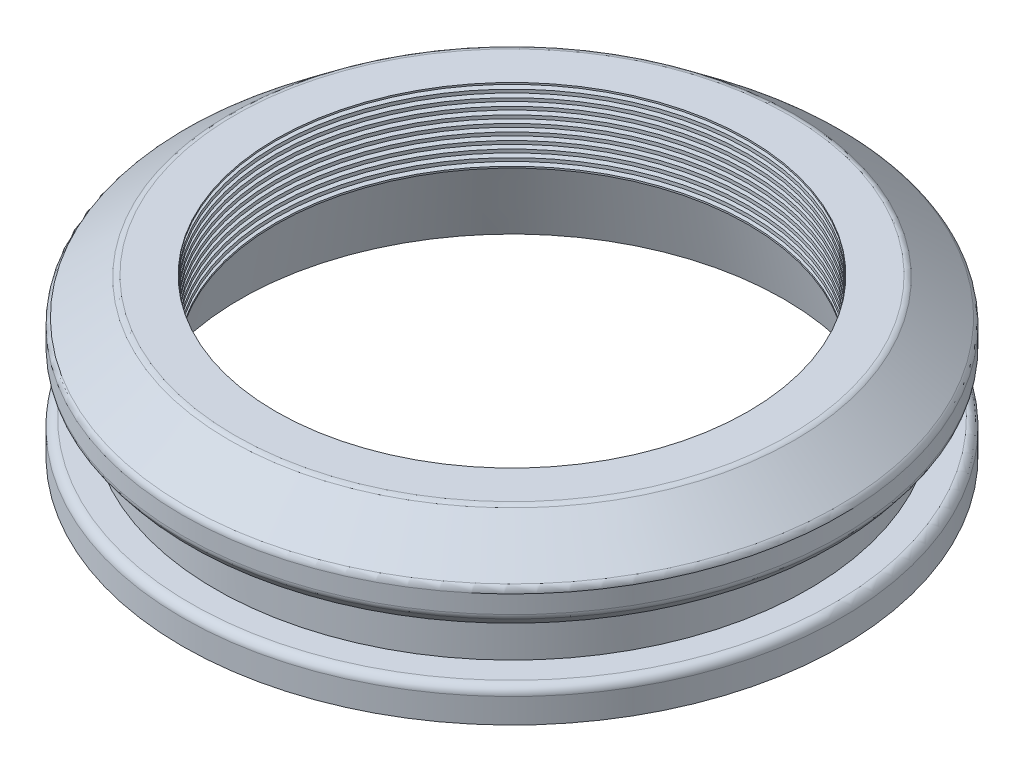
ISO-10303-21;
HEADER;
FILE_DESCRIPTION(('STEP AP214'),'2;1');
FILE_NAME('part.step','',(''),(''),'','','');
FILE_SCHEMA(('AUTOMOTIVE_DESIGN { 1 0 10303 214 1 1 1 1 }'));
ENDSEC;
DATA;
#1=APPLICATION_CONTEXT('core data for automotive mechanical design processes');
#2=APPLICATION_PROTOCOL_DEFINITION('international standard','automotive_design',2000,#1);
#3=PRODUCT_CONTEXT('',#1,'mechanical');
#4=PRODUCT('Part','Part','',(#3));
#5=PRODUCT_RELATED_PRODUCT_CATEGORY('part','',(#4));
#6=PRODUCT_DEFINITION_FORMATION('','',#4);
#7=PRODUCT_DEFINITION_CONTEXT('part definition',#1,'design');
#8=PRODUCT_DEFINITION('design','',#6,#7);
#9=PRODUCT_DEFINITION_SHAPE('','',#8);
#10=(LENGTH_UNIT() NAMED_UNIT(*) SI_UNIT(.MILLI.,.METRE.));
#11=(NAMED_UNIT(*) PLANE_ANGLE_UNIT() SI_UNIT($,.RADIAN.));
#12=(NAMED_UNIT(*) SI_UNIT($,.STERADIAN.) SOLID_ANGLE_UNIT());
#13=UNCERTAINTY_MEASURE_WITH_UNIT(LENGTH_MEASURE(1.E-05),#10,'distance_accuracy_value','');
#14=(GEOMETRIC_REPRESENTATION_CONTEXT(3) GLOBAL_UNCERTAINTY_ASSIGNED_CONTEXT((#13)) GLOBAL_UNIT_ASSIGNED_CONTEXT((#10,
#11,#12)) REPRESENTATION_CONTEXT('',''));
#15=CARTESIAN_POINT('',(0.,0.,0.));
#16=DIRECTION('',(0.,0.,1.));
#17=DIRECTION('',(1.,0.,0.));
#18=AXIS2_PLACEMENT_3D('',#15,#16,#17);
#19=CARTESIAN_POINT('',(101.6,47.117,0.));
#20=DIRECTION('',(0.,-1.,0.));
#21=DIRECTION('',(0.,0.,-1.));
#22=AXIS2_PLACEMENT_3D('',#19,#20,#21);
#23=TOROIDAL_SURFACE('',#22,77.1449944875122,0.254000000000001);
#24=CARTESIAN_POINT('',(101.6,46.8639665466847,0.));
#25=DIRECTION('',(0.,-1.,0.));
#26=DIRECTION('',(0.,0.,-1.));
#27=AXIS2_PLACEMENT_3D('',#24,#25,#26);
#28=CIRCLE('',#27,77.1671320461701);
#29=CARTESIAN_POINT('',(101.6,46.8639665466847,-77.1671320461701));
#30=VERTEX_POINT('',#29);
#31=EDGE_CURVE('E275',#30,#30,#28,.T.);
#32=ORIENTED_EDGE('',*,*,#31,.T.);
#33=EDGE_LOOP('',(#32));
#34=FACE_BOUND('',#33,.T.);
#35=CARTESIAN_POINT('',(101.6,47.3700334533153,0.));
#36=DIRECTION('',(0.,-1.,0.));
#37=DIRECTION('',(0.,0.,-1.));
#38=AXIS2_PLACEMENT_3D('',#35,#36,#37);
#39=CIRCLE('',#38,77.1671320461701);
#40=CARTESIAN_POINT('',(101.6,47.3700334533153,-77.1671320461701));
#41=VERTEX_POINT('',#40);
#42=EDGE_CURVE('E91',#41,#41,#39,.T.);
#43=ORIENTED_EDGE('',*,*,#42,.F.);
#44=EDGE_LOOP('',(#43));
#45=FACE_BOUND('',#44,.T.);
#46=ADVANCED_FACE('F43',(#34,#45),#23,.F.);
#47=CARTESIAN_POINT('',(101.6,47.7520000000001,0.));
#48=DIRECTION('',(0.,-1.,0.));
#49=DIRECTION('',(0.,0.,-1.));
#50=AXIS2_PLACEMENT_3D('',#47,#48,#49);
#51=CONICAL_SURFACE('',#50,72.8012344396587,1.48352986419516);
#52=ORIENTED_EDGE('',*,*,#42,.T.);
#53=EDGE_LOOP('',(#52));
#54=FACE_BOUND('',#53,.T.);
#55=CARTESIAN_POINT('',(101.6,47.7520000000001,0.));
#56=DIRECTION('',(0.,-1.,0.));
#57=DIRECTION('',(0.,0.,-1.));
#58=AXIS2_PLACEMENT_3D('',#55,#56,#57);
#59=CIRCLE('',#58,72.8012344396587);
#60=CARTESIAN_POINT('',(101.6,47.7520000000001,-72.8012344396587));
#61=VERTEX_POINT('',#60);
#62=EDGE_CURVE('E95',#61,#61,#59,.T.);
#63=ORIENTED_EDGE('',*,*,#62,.F.);
#64=EDGE_LOOP('',(#63));
#65=FACE_BOUND('',#64,.T.);
#66=ADVANCED_FACE('F307',(#54,#65),#51,.F.);
#67=CARTESIAN_POINT('',(101.6,0.,0.));
#68=DIRECTION('',(0.,-1.,0.));
#69=DIRECTION('',(0.,0.,-1.));
#70=AXIS2_PLACEMENT_3D('',#67,#68,#69);
#71=CYLINDRICAL_SURFACE('',#70,72.8012344396587);
#72=CARTESIAN_POINT('',(101.6,48.26,0.));
#73=DIRECTION('',(0.,-1.,0.));
#74=DIRECTION('',(0.,0.,-1.));
#75=AXIS2_PLACEMENT_3D('',#72,#73,#74);
#76=CIRCLE('',#75,72.8012344396586);
#77=CARTESIAN_POINT('',(101.6,48.26,-72.8012344396586));
#78=VERTEX_POINT('',#77);
#79=EDGE_CURVE('E99',#78,#78,#76,.T.);
#80=ORIENTED_EDGE('',*,*,#79,.F.);
#81=EDGE_LOOP('',(#80));
#82=FACE_BOUND('',#81,.T.);
#83=ORIENTED_EDGE('',*,*,#62,.T.);
#84=EDGE_LOOP('',(#83));
#85=FACE_BOUND('',#84,.T.);
#86=ADVANCED_FACE('F312',(#82,#85),#71,.F.);
#87=CARTESIAN_POINT('',(0.,48.26,0.));
#88=DIRECTION('',(0.,-1.,0.));
#89=DIRECTION('',(0.,0.,-1.));
#90=AXIS2_PLACEMENT_3D('',#87,#88,#89);
#91=PLANE('',#90);
#92=CARTESIAN_POINT('',(101.6,48.26,0.));
#93=DIRECTION('',(0.,-1.,0.));
#94=DIRECTION('',(0.,0.,-1.));
#95=AXIS2_PLACEMENT_3D('',#92,#93,#94);
#96=CIRCLE('',#95,85.4789076285598);
#97=CARTESIAN_POINT('',(101.6,48.26,-85.4789076285598));
#98=VERTEX_POINT('',#97);
#99=EDGE_CURVE('E83',#98,#98,#96,.F.);
#100=ORIENTED_EDGE('',*,*,#99,.T.);
#101=EDGE_LOOP('',(#100));
#102=FACE_BOUND('',#101,.T.);
#103=ORIENTED_EDGE('',*,*,#79,.T.);
#104=EDGE_LOOP('',(#103));
#105=FACE_BOUND('',#104,.T.);
#106=ADVANCED_FACE('F370',(#102,#105),#91,.F.);
#107=CARTESIAN_POINT('',(101.6,48.26,0.));
#108=DIRECTION('',(0.,-1.,0.));
#109=DIRECTION('',(0.,0.,-1.));
#110=AXIS2_PLACEMENT_3D('',#107,#108,#109);
#111=CONICAL_SURFACE('',#110,86.36,0.902999038323178);
#112=CARTESIAN_POINT('',(101.6,37.0033066912619,0.));
#113=DIRECTION('',(0.,1.,0.));
#114=DIRECTION('',(0.,0.,1.));
#115=AXIS2_PLACEMENT_3D('',#112,#113,#114);
#116=CIRCLE('',#115,100.632915190259);
#117=CARTESIAN_POINT('',(101.6,37.0033066912619,100.632915190259));
#118=VERTEX_POINT('',#117);
#119=EDGE_CURVE('E10',#118,#118,#116,.T.);
#120=ORIENTED_EDGE('',*,*,#119,.T.);
#121=EDGE_LOOP('',(#120));
#122=FACE_BOUND('',#121,.T.);
#123=CARTESIAN_POINT('',(101.6,47.714376545252,0.));
#124=DIRECTION('',(0.,1.,0.));
#125=DIRECTION('',(0.,0.,1.));
#126=AXIS2_PLACEMENT_3D('',#123,#124,#125);
#127=CIRCLE('',#126,87.0518228188192);
#128=CARTESIAN_POINT('',(101.6,47.714376545252,87.0518228188192));
#129=VERTEX_POINT('',#128);
#130=EDGE_CURVE('E87',#129,#129,#127,.F.);
#131=ORIENTED_EDGE('',*,*,#130,.T.);
#132=EDGE_LOOP('',(#131));
#133=FACE_BOUND('',#132,.T.);
#134=ADVANCED_FACE('F366',(#122,#133),#111,.T.);
#135=CARTESIAN_POINT('',(101.6,0.,0.));
#136=DIRECTION('',(0.,-1.,0.));
#137=DIRECTION('',(0.,0.,-1.));
#138=AXIS2_PLACEMENT_3D('',#135,#136,#137);
#139=CYLINDRICAL_SURFACE('',#138,101.6);
#140=CARTESIAN_POINT('',(101.6,29.5016833202152,0.));
#141=DIRECTION('',(0.,1.,0.));
#142=DIRECTION('',(0.,0.,1.));
#143=AXIS2_PLACEMENT_3D('',#140,#141,#142);
#144=CIRCLE('',#143,101.6);
#145=CARTESIAN_POINT('',(101.6,29.5016833202152,101.6));
#146=VERTEX_POINT('',#145);
#147=EDGE_CURVE('E71',#146,#146,#144,.T.);
#148=ORIENTED_EDGE('',*,*,#147,.T.);
#149=EDGE_LOOP('',(#148));
#150=FACE_BOUND('',#149,.T.);
#151=CARTESIAN_POINT('',(101.6,35.0089301460098,0.));
#152=DIRECTION('',(0.,1.,0.));
#153=DIRECTION('',(0.,0.,1.));
#154=AXIS2_PLACEMENT_3D('',#151,#152,#153);
#155=CIRCLE('',#154,101.6);
#156=CARTESIAN_POINT('',(101.6,35.0089301460098,101.6));
#157=VERTEX_POINT('',#156);
#158=EDGE_CURVE('E75',#157,#157,#155,.F.);
#159=ORIENTED_EDGE('',*,*,#158,.T.);
#160=EDGE_LOOP('',(#159));
#161=FACE_BOUND('',#160,.T.);
#162=ADVANCED_FACE('F362',(#150,#161),#139,.T.);
#163=CARTESIAN_POINT('',(101.6,28.6205909487751,0.));
#164=DIRECTION('',(0.,1.,0.));
#165=DIRECTION('',(0.,0.,1.));
#166=AXIS2_PLACEMENT_3D('',#163,#164,#165);
#167=CONICAL_SURFACE('',#166,101.6,0.667797288471719);
#168=CARTESIAN_POINT('',(101.6,27.9287681299559,0.));
#169=DIRECTION('',(0.,-1.,0.));
#170=DIRECTION('',(0.,0.,-1.));
#171=AXIS2_PLACEMENT_3D('',#168,#169,#170);
#172=CIRCLE('',#171,101.054376545252);
#173=CARTESIAN_POINT('',(101.6,27.9287681299559,-101.054376545252));
#174=VERTEX_POINT('',#173);
#175=EDGE_CURVE('E79',#174,#174,#172,.T.);
#176=ORIENTED_EDGE('',*,*,#175,.T.);
#177=EDGE_LOOP('',(#176));
#178=FACE_BOUND('',#177,.T.);
#179=CARTESIAN_POINT('',(101.6,25.4,0.));
#180=DIRECTION('',(0.,-1.,0.));
#181=DIRECTION('',(0.,0.,-1.));
#182=AXIS2_PLACEMENT_3D('',#179,#180,#181);
#183=CIRCLE('',#182,99.06);
#184=CARTESIAN_POINT('',(101.6,25.4,-99.06));
#185=VERTEX_POINT('',#184);
#186=EDGE_CURVE('E103',#185,#185,#183,.T.);
#187=ORIENTED_EDGE('',*,*,#186,.F.);
#188=EDGE_LOOP('',(#187));
#189=FACE_BOUND('',#188,.T.);
#190=ADVANCED_FACE('F359',(#178,#189),#167,.T.);
#191=CARTESIAN_POINT('',(0.,25.4,0.));
#192=DIRECTION('',(0.,1.,0.));
#193=DIRECTION('',(0.,0.,1.));
#194=AXIS2_PLACEMENT_3D('',#191,#192,#193);
#195=PLANE('',#194);
#196=CARTESIAN_POINT('',(101.6,25.4,0.));
#197=DIRECTION('',(0.,1.,0.));
#198=DIRECTION('',(0.,0.,1.));
#199=AXIS2_PLACEMENT_3D('',#196,#197,#198);
#200=CIRCLE('',#199,93.98);
#201=CARTESIAN_POINT('',(101.6,25.4,93.98));
#202=VERTEX_POINT('',#201);
#203=EDGE_CURVE('E51',#202,#202,#200,.T.);
#204=ORIENTED_EDGE('',*,*,#203,.T.);
#205=EDGE_LOOP('',(#204));
#206=FACE_BOUND('',#205,.T.);
#207=ORIENTED_EDGE('',*,*,#186,.T.);
#208=EDGE_LOOP('',(#207));
#209=FACE_BOUND('',#208,.T.);
#210=ADVANCED_FACE('F341',(#206,#209),#195,.F.);
#211=CARTESIAN_POINT('',(101.6,0.,0.));
#212=DIRECTION('',(0.,-1.,0.));
#213=DIRECTION('',(0.,0.,-1.));
#214=AXIS2_PLACEMENT_3D('',#211,#212,#213);
#215=CYLINDRICAL_SURFACE('',#214,91.44);
#216=CARTESIAN_POINT('',(101.6,22.86,0.));
#217=DIRECTION('',(0.,1.,0.));
#218=DIRECTION('',(0.,0.,1.));
#219=AXIS2_PLACEMENT_3D('',#216,#217,#218);
#220=CIRCLE('',#219,91.44);
#221=CARTESIAN_POINT('',(101.6,22.86,91.44));
#222=VERTEX_POINT('',#221);
#223=EDGE_CURVE('E56',#222,#222,#220,.F.);
#224=ORIENTED_EDGE('',*,*,#223,.T.);
#225=EDGE_LOOP('',(#224));
#226=FACE_BOUND('',#225,.T.);
#227=CARTESIAN_POINT('',(101.6,10.16,0.));
#228=DIRECTION('',(0.,-1.,0.));
#229=DIRECTION('',(0.,0.,-1.));
#230=AXIS2_PLACEMENT_3D('',#227,#228,#229);
#231=CIRCLE('',#230,91.44);
#232=CARTESIAN_POINT('',(101.6,10.16,-91.44));
#233=VERTEX_POINT('',#232);
#234=EDGE_CURVE('E107',#233,#233,#231,.T.);
#235=ORIENTED_EDGE('',*,*,#234,.F.);
#236=EDGE_LOOP('',(#235));
#237=FACE_BOUND('',#236,.T.);
#238=ADVANCED_FACE('F337',(#226,#237),#215,.T.);
#239=CARTESIAN_POINT('',(0.,10.16,0.));
#240=DIRECTION('',(0.,-1.,0.));
#241=DIRECTION('',(0.,0.,-1.));
#242=AXIS2_PLACEMENT_3D('',#239,#240,#241);
#243=PLANE('',#242);
#244=CARTESIAN_POINT('',(101.6,10.16,0.));
#245=DIRECTION('',(0.,-1.,0.));
#246=DIRECTION('',(0.,0.,-1.));
#247=AXIS2_PLACEMENT_3D('',#244,#245,#246);
#248=CIRCLE('',#247,99.06);
#249=CARTESIAN_POINT('',(101.6,10.16,-99.06));
#250=VERTEX_POINT('',#249);
#251=EDGE_CURVE('E61',#250,#250,#248,.F.);
#252=ORIENTED_EDGE('',*,*,#251,.T.);
#253=EDGE_LOOP('',(#252));
#254=FACE_BOUND('',#253,.T.);
#255=ORIENTED_EDGE('',*,*,#234,.T.);
#256=EDGE_LOOP('',(#255));
#257=FACE_BOUND('',#256,.T.);
#258=ADVANCED_FACE('F340',(#254,#257),#243,.F.);
#259=CARTESIAN_POINT('',(101.6,0.,0.));
#260=DIRECTION('',(0.,-1.,0.));
#261=DIRECTION('',(0.,0.,-1.));
#262=AXIS2_PLACEMENT_3D('',#259,#260,#261);
#263=CYLINDRICAL_SURFACE('',#262,101.6);
#264=CARTESIAN_POINT('',(101.6,7.62,0.));
#265=DIRECTION('',(0.,-1.,0.));
#266=DIRECTION('',(0.,0.,-1.));
#267=AXIS2_PLACEMENT_3D('',#264,#265,#266);
#268=CIRCLE('',#267,101.6);
#269=CARTESIAN_POINT('',(101.6,7.62,-101.6));
#270=VERTEX_POINT('',#269);
#271=EDGE_CURVE('E67',#270,#270,#268,.T.);
#272=ORIENTED_EDGE('',*,*,#271,.T.);
#273=EDGE_LOOP('',(#272));
#274=FACE_BOUND('',#273,.T.);
#275=CARTESIAN_POINT('',(101.6,0.,0.));
#276=DIRECTION('',(0.,-1.,0.));
#277=DIRECTION('',(0.,0.,-1.));
#278=AXIS2_PLACEMENT_3D('',#275,#276,#277);
#279=CIRCLE('',#278,101.6);
#280=CARTESIAN_POINT('',(101.6,0.,-101.6));
#281=VERTEX_POINT('',#280);
#282=EDGE_CURVE('E111',#281,#281,#279,.T.);
#283=ORIENTED_EDGE('',*,*,#282,.F.);
#284=EDGE_LOOP('',(#283));
#285=FACE_BOUND('',#284,.T.);
#286=ADVANCED_FACE('F346',(#274,#285),#263,.T.);
#287=CARTESIAN_POINT('',(0.,0.,0.));
#288=DIRECTION('',(0.,1.,0.));
#289=DIRECTION('',(0.,0.,1.));
#290=AXIS2_PLACEMENT_3D('',#287,#288,#289);
#291=PLANE('',#290);
#292=CARTESIAN_POINT('',(101.6,0.,0.));
#293=DIRECTION('',(0.,-1.,0.));
#294=DIRECTION('',(0.,0.,-1.));
#295=AXIS2_PLACEMENT_3D('',#292,#293,#294);
#296=CIRCLE('',#295,83.82);
#297=CARTESIAN_POINT('',(101.6,0.,-83.82));
#298=VERTEX_POINT('',#297);
#299=EDGE_CURVE('E115',#298,#298,#296,.T.);
#300=ORIENTED_EDGE('',*,*,#299,.F.);
#301=EDGE_LOOP('',(#300));
#302=FACE_BOUND('',#301,.T.);
#303=ORIENTED_EDGE('',*,*,#282,.T.);
#304=EDGE_LOOP('',(#303));
#305=FACE_BOUND('',#304,.T.);
#306=ADVANCED_FACE('F352',(#302,#305),#291,.F.);
#307=CARTESIAN_POINT('',(101.6,25.4,0.));
#308=DIRECTION('',(0.,-1.,0.));
#309=DIRECTION('',(0.,0.,-1.));
#310=AXIS2_PLACEMENT_3D('',#307,#308,#309);
#311=CONICAL_SURFACE('',#310,77.8812344396586,0.229683625315949);
#312=ORIENTED_EDGE('',*,*,#299,.T.);
#313=EDGE_LOOP('',(#312));
#314=FACE_BOUND('',#313,.T.);
#315=CARTESIAN_POINT('',(101.6,25.4,0.));
#316=DIRECTION('',(0.,-1.,0.));
#317=DIRECTION('',(0.,0.,-1.));
#318=AXIS2_PLACEMENT_3D('',#315,#316,#317);
#319=CIRCLE('',#318,77.8812344396586);
#320=CARTESIAN_POINT('',(101.6,25.4,-77.8812344396586));
#321=VERTEX_POINT('',#320);
#322=EDGE_CURVE('E119',#321,#321,#319,.T.);
#323=ORIENTED_EDGE('',*,*,#322,.F.);
#324=EDGE_LOOP('',(#323));
#325=FACE_BOUND('',#324,.T.);
#326=ADVANCED_FACE('F392',(#314,#325),#311,.F.);
#327=CARTESIAN_POINT('',(0.,25.4,0.));
#328=DIRECTION('',(0.,1.,0.));
#329=DIRECTION('',(0.,0.,1.));
#330=AXIS2_PLACEMENT_3D('',#327,#328,#329);
#331=PLANE('',#330);
#332=CARTESIAN_POINT('',(101.6,25.4,0.));
#333=DIRECTION('',(0.,-1.,0.));
#334=DIRECTION('',(0.,0.,-1.));
#335=AXIS2_PLACEMENT_3D('',#332,#333,#334);
#336=CIRCLE('',#335,72.8012344396586);
#337=CARTESIAN_POINT('',(101.6,25.4,-72.8012344396586));
#338=VERTEX_POINT('',#337);
#339=EDGE_CURVE('E123',#338,#338,#336,.T.);
#340=ORIENTED_EDGE('',*,*,#339,.F.);
#341=EDGE_LOOP('',(#340));
#342=FACE_BOUND('',#341,.T.);
#343=ORIENTED_EDGE('',*,*,#322,.T.);
#344=EDGE_LOOP('',(#343));
#345=FACE_BOUND('',#344,.T.);
#346=ADVANCED_FACE('F401',(#342,#345),#331,.F.);
#347=CARTESIAN_POINT('',(101.6,0.,0.));
#348=DIRECTION('',(0.,-1.,0.));
#349=DIRECTION('',(0.,0.,-1.));
#350=AXIS2_PLACEMENT_3D('',#347,#348,#349);
#351=CYLINDRICAL_SURFACE('',#350,72.8012344396586);
#352=CARTESIAN_POINT('',(101.6,25.908,0.));
#353=DIRECTION('',(0.,-1.,0.));
#354=DIRECTION('',(0.,0.,-1.));
#355=AXIS2_PLACEMENT_3D('',#352,#353,#354);
#356=CIRCLE('',#355,72.8012344396586);
#357=CARTESIAN_POINT('',(101.6,25.908,-72.8012344396586));
#358=VERTEX_POINT('',#357);
#359=EDGE_CURVE('E127',#358,#358,#356,.T.);
#360=ORIENTED_EDGE('',*,*,#359,.F.);
#361=EDGE_LOOP('',(#360));
#362=FACE_BOUND('',#361,.T.);
#363=ORIENTED_EDGE('',*,*,#339,.T.);
#364=EDGE_LOOP('',(#363));
#365=FACE_BOUND('',#364,.T.);
#366=ADVANCED_FACE('F410',(#362,#365),#351,.F.);
#367=CARTESIAN_POINT('',(101.6,25.908,0.));
#368=DIRECTION('',(0.,1.,0.));
#369=DIRECTION('',(0.,0.,1.));
#370=AXIS2_PLACEMENT_3D('',#367,#368,#369);
#371=CONICAL_SURFACE('',#370,72.8012344396586,1.48352986419519);
#372=CARTESIAN_POINT('',(101.6,26.2899665466847,0.));
#373=DIRECTION('',(0.,-1.,0.));
#374=DIRECTION('',(0.,0.,-1.));
#375=AXIS2_PLACEMENT_3D('',#372,#373,#374);
#376=CIRCLE('',#375,77.1671320461701);
#377=CARTESIAN_POINT('',(101.6,26.2899665466847,-77.1671320461701));
#378=VERTEX_POINT('',#377);
#379=EDGE_CURVE('E131',#378,#378,#376,.T.);
#380=ORIENTED_EDGE('',*,*,#379,.F.);
#381=EDGE_LOOP('',(#380));
#382=FACE_BOUND('',#381,.T.);
#383=ORIENTED_EDGE('',*,*,#359,.T.);
#384=EDGE_LOOP('',(#383));
#385=FACE_BOUND('',#384,.T.);
#386=ADVANCED_FACE('F419',(#382,#385),#371,.F.);
#387=CARTESIAN_POINT('',(101.6,26.543,0.));
#388=DIRECTION('',(0.,-1.,0.));
#389=DIRECTION('',(0.,0.,-1.));
#390=AXIS2_PLACEMENT_3D('',#387,#388,#389);
#391=TOROIDAL_SURFACE('',#390,77.144994487512,0.254000000000013);
#392=ORIENTED_EDGE('',*,*,#379,.T.);
#393=EDGE_LOOP('',(#392));
#394=FACE_BOUND('',#393,.T.);
#395=CARTESIAN_POINT('',(101.6,26.7960334533153,0.));
#396=DIRECTION('',(0.,-1.,0.));
#397=DIRECTION('',(0.,0.,-1.));
#398=AXIS2_PLACEMENT_3D('',#395,#396,#397);
#399=CIRCLE('',#398,77.16713204617);
#400=CARTESIAN_POINT('',(101.6,26.7960334533153,-77.16713204617));
#401=VERTEX_POINT('',#400);
#402=EDGE_CURVE('E135',#401,#401,#399,.T.);
#403=ORIENTED_EDGE('',*,*,#402,.F.);
#404=EDGE_LOOP('',(#403));
#405=FACE_BOUND('',#404,.T.);
#406=ADVANCED_FACE('F428',(#394,#405),#391,.F.);
#407=CARTESIAN_POINT('',(101.6,27.178,0.));
#408=DIRECTION('',(0.,-1.,0.));
#409=DIRECTION('',(0.,0.,-1.));
#410=AXIS2_PLACEMENT_3D('',#407,#408,#409);
#411=CONICAL_SURFACE('',#410,72.8012344396586,1.48352986419518);
#412=ORIENTED_EDGE('',*,*,#402,.T.);
#413=EDGE_LOOP('',(#412));
#414=FACE_BOUND('',#413,.T.);
#415=CARTESIAN_POINT('',(101.6,27.178,0.));
#416=DIRECTION('',(0.,-1.,0.));
#417=DIRECTION('',(0.,0.,-1.));
#418=AXIS2_PLACEMENT_3D('',#415,#416,#417);
#419=CIRCLE('',#418,72.8012344396586);
#420=CARTESIAN_POINT('',(101.6,27.178,-72.8012344396586));
#421=VERTEX_POINT('',#420);
#422=EDGE_CURVE('E139',#421,#421,#419,.T.);
#423=ORIENTED_EDGE('',*,*,#422,.F.);
#424=EDGE_LOOP('',(#423));
#425=FACE_BOUND('',#424,.T.);
#426=ADVANCED_FACE('F437',(#414,#425),#411,.F.);
#427=CARTESIAN_POINT('',(101.6,0.,0.));
#428=DIRECTION('',(0.,-1.,0.));
#429=DIRECTION('',(0.,0.,-1.));
#430=AXIS2_PLACEMENT_3D('',#427,#428,#429);
#431=CYLINDRICAL_SURFACE('',#430,72.8012344396586);
#432=CARTESIAN_POINT('',(101.6,28.194,0.));
#433=DIRECTION('',(0.,-1.,0.));
#434=DIRECTION('',(0.,0.,-1.));
#435=AXIS2_PLACEMENT_3D('',#432,#433,#434);
#436=CIRCLE('',#435,72.8012344396586);
#437=CARTESIAN_POINT('',(101.6,28.194,-72.8012344396586));
#438=VERTEX_POINT('',#437);
#439=EDGE_CURVE('E143',#438,#438,#436,.T.);
#440=ORIENTED_EDGE('',*,*,#439,.F.);
#441=EDGE_LOOP('',(#440));
#442=FACE_BOUND('',#441,.T.);
#443=ORIENTED_EDGE('',*,*,#422,.T.);
#444=EDGE_LOOP('',(#443));
#445=FACE_BOUND('',#444,.T.);
#446=ADVANCED_FACE('F446',(#442,#445),#431,.F.);
#447=CARTESIAN_POINT('',(101.6,28.194,0.));
#448=DIRECTION('',(0.,1.,0.));
#449=DIRECTION('',(0.,0.,1.));
#450=AXIS2_PLACEMENT_3D('',#447,#448,#449);
#451=CONICAL_SURFACE('',#450,72.8012344396586,1.48352986419519);
#452=CARTESIAN_POINT('',(101.6,28.5759665466847,0.));
#453=DIRECTION('',(0.,-1.,0.));
#454=DIRECTION('',(0.,0.,-1.));
#455=AXIS2_PLACEMENT_3D('',#452,#453,#454);
#456=CIRCLE('',#455,77.16713204617);
#457=CARTESIAN_POINT('',(101.6,28.5759665466847,-77.16713204617));
#458=VERTEX_POINT('',#457);
#459=EDGE_CURVE('E147',#458,#458,#456,.T.);
#460=ORIENTED_EDGE('',*,*,#459,.F.);
#461=EDGE_LOOP('',(#460));
#462=FACE_BOUND('',#461,.T.);
#463=ORIENTED_EDGE('',*,*,#439,.T.);
#464=EDGE_LOOP('',(#463));
#465=FACE_BOUND('',#464,.T.);
#466=ADVANCED_FACE('F455',(#462,#465),#451,.F.);
#467=CARTESIAN_POINT('',(101.6,28.829,0.));
#468=DIRECTION('',(0.,-1.,0.));
#469=DIRECTION('',(0.,0.,-1.));
#470=AXIS2_PLACEMENT_3D('',#467,#468,#469);
#471=TOROIDAL_SURFACE('',#470,77.1449944875121,0.253999999999999);
#472=ORIENTED_EDGE('',*,*,#459,.T.);
#473=EDGE_LOOP('',(#472));
#474=FACE_BOUND('',#473,.T.);
#475=CARTESIAN_POINT('',(101.6,29.0820334533153,0.));
#476=DIRECTION('',(0.,-1.,0.));
#477=DIRECTION('',(0.,0.,-1.));
#478=AXIS2_PLACEMENT_3D('',#475,#476,#477);
#479=CIRCLE('',#478,77.16713204617);
#480=CARTESIAN_POINT('',(101.6,29.0820334533153,-77.16713204617));
#481=VERTEX_POINT('',#480);
#482=EDGE_CURVE('E151',#481,#481,#479,.T.);
#483=ORIENTED_EDGE('',*,*,#482,.F.);
#484=EDGE_LOOP('',(#483));
#485=FACE_BOUND('',#484,.T.);
#486=ADVANCED_FACE('F464',(#474,#485),#471,.F.);
#487=CARTESIAN_POINT('',(101.6,29.4640000000001,0.));
#488=DIRECTION('',(0.,-1.,0.));
#489=DIRECTION('',(0.,0.,-1.));
#490=AXIS2_PLACEMENT_3D('',#487,#488,#489);
#491=CONICAL_SURFACE('',#490,72.8012344396586,1.48352986419516);
#492=ORIENTED_EDGE('',*,*,#482,.T.);
#493=EDGE_LOOP('',(#492));
#494=FACE_BOUND('',#493,.T.);
#495=CARTESIAN_POINT('',(101.6,29.4640000000001,0.));
#496=DIRECTION('',(0.,-1.,0.));
#497=DIRECTION('',(0.,0.,-1.));
#498=AXIS2_PLACEMENT_3D('',#495,#496,#497);
#499=CIRCLE('',#498,72.8012344396586);
#500=CARTESIAN_POINT('',(101.6,29.4640000000001,-72.8012344396586));
#501=VERTEX_POINT('',#500);
#502=EDGE_CURVE('E155',#501,#501,#499,.T.);
#503=ORIENTED_EDGE('',*,*,#502,.F.);
#504=EDGE_LOOP('',(#503));
#505=FACE_BOUND('',#504,.T.);
#506=ADVANCED_FACE('F473',(#494,#505),#491,.F.);
#507=CARTESIAN_POINT('',(101.6,0.,0.));
#508=DIRECTION('',(0.,-1.,0.));
#509=DIRECTION('',(0.,0.,-1.));
#510=AXIS2_PLACEMENT_3D('',#507,#508,#509);
#511=CYLINDRICAL_SURFACE('',#510,72.8012344396587);
#512=CARTESIAN_POINT('',(101.6,30.4800000000001,0.));
#513=DIRECTION('',(0.,-1.,0.));
#514=DIRECTION('',(0.,0.,-1.));
#515=AXIS2_PLACEMENT_3D('',#512,#513,#514);
#516=CIRCLE('',#515,72.8012344396587);
#517=CARTESIAN_POINT('',(101.6,30.4800000000001,-72.8012344396587));
#518=VERTEX_POINT('',#517);
#519=EDGE_CURVE('E159',#518,#518,#516,.T.);
#520=ORIENTED_EDGE('',*,*,#519,.F.);
#521=EDGE_LOOP('',(#520));
#522=FACE_BOUND('',#521,.T.);
#523=ORIENTED_EDGE('',*,*,#502,.T.);
#524=EDGE_LOOP('',(#523));
#525=FACE_BOUND('',#524,.T.);
#526=ADVANCED_FACE('F482',(#522,#525),#511,.F.);
#527=CARTESIAN_POINT('',(101.6,30.4800000000001,0.));
#528=DIRECTION('',(0.,1.,0.));
#529=DIRECTION('',(0.,0.,1.));
#530=AXIS2_PLACEMENT_3D('',#527,#528,#529);
#531=CONICAL_SURFACE('',#530,72.8012344396587,1.48352986419521);
#532=CARTESIAN_POINT('',(101.6,30.8619665466847,0.));
#533=DIRECTION('',(0.,-1.,0.));
#534=DIRECTION('',(0.,0.,-1.));
#535=AXIS2_PLACEMENT_3D('',#532,#533,#534);
#536=CIRCLE('',#535,77.1671320461701);
#537=CARTESIAN_POINT('',(101.6,30.8619665466847,-77.1671320461701));
#538=VERTEX_POINT('',#537);
#539=EDGE_CURVE('E163',#538,#538,#536,.T.);
#540=ORIENTED_EDGE('',*,*,#539,.F.);
#541=EDGE_LOOP('',(#540));
#542=FACE_BOUND('',#541,.T.);
#543=ORIENTED_EDGE('',*,*,#519,.T.);
#544=EDGE_LOOP('',(#543));
#545=FACE_BOUND('',#544,.T.);
#546=ADVANCED_FACE('F491',(#542,#545),#531,.F.);
#547=CARTESIAN_POINT('',(101.6,31.115,0.));
#548=DIRECTION('',(0.,-1.,0.));
#549=DIRECTION('',(0.,0.,-1.));
#550=AXIS2_PLACEMENT_3D('',#547,#548,#549);
#551=TOROIDAL_SURFACE('',#550,77.1449944875121,0.254000000000001);
#552=ORIENTED_EDGE('',*,*,#539,.T.);
#553=EDGE_LOOP('',(#552));
#554=FACE_BOUND('',#553,.T.);
#555=CARTESIAN_POINT('',(101.6,31.3680334533153,0.));
#556=DIRECTION('',(0.,-1.,0.));
#557=DIRECTION('',(0.,0.,-1.));
#558=AXIS2_PLACEMENT_3D('',#555,#556,#557);
#559=CIRCLE('',#558,77.1671320461701);
#560=CARTESIAN_POINT('',(101.6,31.3680334533153,-77.1671320461701));
#561=VERTEX_POINT('',#560);
#562=EDGE_CURVE('E167',#561,#561,#559,.T.);
#563=ORIENTED_EDGE('',*,*,#562,.F.);
#564=EDGE_LOOP('',(#563));
#565=FACE_BOUND('',#564,.T.);
#566=ADVANCED_FACE('F500',(#554,#565),#551,.F.);
#567=CARTESIAN_POINT('',(101.6,31.7500000000001,0.));
#568=DIRECTION('',(0.,-1.,0.));
#569=DIRECTION('',(0.,0.,-1.));
#570=AXIS2_PLACEMENT_3D('',#567,#568,#569);
#571=CONICAL_SURFACE('',#570,72.8012344396587,1.48352986419516);
#572=ORIENTED_EDGE('',*,*,#562,.T.);
#573=EDGE_LOOP('',(#572));
#574=FACE_BOUND('',#573,.T.);
#575=CARTESIAN_POINT('',(101.6,31.7500000000001,0.));
#576=DIRECTION('',(0.,-1.,0.));
#577=DIRECTION('',(0.,0.,-1.));
#578=AXIS2_PLACEMENT_3D('',#575,#576,#577);
#579=CIRCLE('',#578,72.8012344396587);
#580=CARTESIAN_POINT('',(101.6,31.7500000000001,-72.8012344396587));
#581=VERTEX_POINT('',#580);
#582=EDGE_CURVE('E171',#581,#581,#579,.T.);
#583=ORIENTED_EDGE('',*,*,#582,.F.);
#584=EDGE_LOOP('',(#583));
#585=FACE_BOUND('',#584,.T.);
#586=ADVANCED_FACE('F509',(#574,#585),#571,.F.);
#587=CARTESIAN_POINT('',(101.6,0.,0.));
#588=DIRECTION('',(0.,-1.,0.));
#589=DIRECTION('',(0.,0.,-1.));
#590=AXIS2_PLACEMENT_3D('',#587,#588,#589);
#591=CYLINDRICAL_SURFACE('',#590,72.8012344396587);
#592=CARTESIAN_POINT('',(101.6,32.766,0.));
#593=DIRECTION('',(0.,-1.,0.));
#594=DIRECTION('',(0.,0.,-1.));
#595=AXIS2_PLACEMENT_3D('',#592,#593,#594);
#596=CIRCLE('',#595,72.8012344396587);
#597=CARTESIAN_POINT('',(101.6,32.766,-72.8012344396587));
#598=VERTEX_POINT('',#597);
#599=EDGE_CURVE('E175',#598,#598,#596,.T.);
#600=ORIENTED_EDGE('',*,*,#599,.F.);
#601=EDGE_LOOP('',(#600));
#602=FACE_BOUND('',#601,.T.);
#603=ORIENTED_EDGE('',*,*,#582,.T.);
#604=EDGE_LOOP('',(#603));
#605=FACE_BOUND('',#604,.T.);
#606=ADVANCED_FACE('F518',(#602,#605),#591,.F.);
#607=CARTESIAN_POINT('',(101.6,32.766,0.));
#608=DIRECTION('',(0.,1.,0.));
#609=DIRECTION('',(0.,0.,1.));
#610=AXIS2_PLACEMENT_3D('',#607,#608,#609);
#611=CONICAL_SURFACE('',#610,72.8012344396587,1.48352986419519);
#612=CARTESIAN_POINT('',(101.6,33.1479665466847,0.));
#613=DIRECTION('',(0.,-1.,0.));
#614=DIRECTION('',(0.,0.,-1.));
#615=AXIS2_PLACEMENT_3D('',#612,#613,#614);
#616=CIRCLE('',#615,77.1671320461701);
#617=CARTESIAN_POINT('',(101.6,33.1479665466847,-77.1671320461701));
#618=VERTEX_POINT('',#617);
#619=EDGE_CURVE('E179',#618,#618,#616,.T.);
#620=ORIENTED_EDGE('',*,*,#619,.F.);
#621=EDGE_LOOP('',(#620));
#622=FACE_BOUND('',#621,.T.);
#623=ORIENTED_EDGE('',*,*,#599,.T.);
#624=EDGE_LOOP('',(#623));
#625=FACE_BOUND('',#624,.T.);
#626=ADVANCED_FACE('F527',(#622,#625),#611,.F.);
#627=CARTESIAN_POINT('',(101.6,33.401,0.));
#628=DIRECTION('',(0.,-1.,0.));
#629=DIRECTION('',(0.,0.,-1.));
#630=AXIS2_PLACEMENT_3D('',#627,#628,#629);
#631=TOROIDAL_SURFACE('',#630,77.1449944875122,0.253999999999998);
#632=ORIENTED_EDGE('',*,*,#619,.T.);
#633=EDGE_LOOP('',(#632));
#634=FACE_BOUND('',#633,.T.);
#635=CARTESIAN_POINT('',(101.6,33.6540334533153,0.));
#636=DIRECTION('',(0.,-1.,0.));
#637=DIRECTION('',(0.,0.,-1.));
#638=AXIS2_PLACEMENT_3D('',#635,#636,#637);
#639=CIRCLE('',#638,77.1671320461701);
#640=CARTESIAN_POINT('',(101.6,33.6540334533153,-77.1671320461701));
#641=VERTEX_POINT('',#640);
#642=EDGE_CURVE('E183',#641,#641,#639,.T.);
#643=ORIENTED_EDGE('',*,*,#642,.F.);
#644=EDGE_LOOP('',(#643));
#645=FACE_BOUND('',#644,.T.);
#646=ADVANCED_FACE('F536',(#634,#645),#631,.F.);
#647=CARTESIAN_POINT('',(101.6,34.0360000000001,0.));
#648=DIRECTION('',(0.,-1.,0.));
#649=DIRECTION('',(0.,0.,-1.));
#650=AXIS2_PLACEMENT_3D('',#647,#648,#649);
#651=CONICAL_SURFACE('',#650,72.8012344396587,1.48352986419516);
#652=ORIENTED_EDGE('',*,*,#642,.T.);
#653=EDGE_LOOP('',(#652));
#654=FACE_BOUND('',#653,.T.);
#655=CARTESIAN_POINT('',(101.6,34.0360000000001,0.));
#656=DIRECTION('',(0.,-1.,0.));
#657=DIRECTION('',(0.,0.,-1.));
#658=AXIS2_PLACEMENT_3D('',#655,#656,#657);
#659=CIRCLE('',#658,72.8012344396587);
#660=CARTESIAN_POINT('',(101.6,34.0360000000001,-72.8012344396587));
#661=VERTEX_POINT('',#660);
#662=EDGE_CURVE('E187',#661,#661,#659,.T.);
#663=ORIENTED_EDGE('',*,*,#662,.F.);
#664=EDGE_LOOP('',(#663));
#665=FACE_BOUND('',#664,.T.);
#666=ADVANCED_FACE('F545',(#654,#665),#651,.F.);
#667=CARTESIAN_POINT('',(101.6,0.,0.));
#668=DIRECTION('',(0.,-1.,0.));
#669=DIRECTION('',(0.,0.,-1.));
#670=AXIS2_PLACEMENT_3D('',#667,#668,#669);
#671=CYLINDRICAL_SURFACE('',#670,72.8012344396587);
#672=CARTESIAN_POINT('',(101.6,35.052,0.));
#673=DIRECTION('',(0.,-1.,0.));
#674=DIRECTION('',(0.,0.,-1.));
#675=AXIS2_PLACEMENT_3D('',#672,#673,#674);
#676=CIRCLE('',#675,72.8012344396587);
#677=CARTESIAN_POINT('',(101.6,35.052,-72.8012344396587));
#678=VERTEX_POINT('',#677);
#679=EDGE_CURVE('E191',#678,#678,#676,.T.);
#680=ORIENTED_EDGE('',*,*,#679,.F.);
#681=EDGE_LOOP('',(#680));
#682=FACE_BOUND('',#681,.T.);
#683=ORIENTED_EDGE('',*,*,#662,.T.);
#684=EDGE_LOOP('',(#683));
#685=FACE_BOUND('',#684,.T.);
#686=ADVANCED_FACE('F554',(#682,#685),#671,.F.);
#687=CARTESIAN_POINT('',(101.6,35.052,0.));
#688=DIRECTION('',(0.,1.,0.));
#689=DIRECTION('',(0.,0.,1.));
#690=AXIS2_PLACEMENT_3D('',#687,#688,#689);
#691=CONICAL_SURFACE('',#690,72.8012344396587,1.48352986419519);
#692=CARTESIAN_POINT('',(101.6,35.4339665466847,0.));
#693=DIRECTION('',(0.,-1.,0.));
#694=DIRECTION('',(0.,0.,-1.));
#695=AXIS2_PLACEMENT_3D('',#692,#693,#694);
#696=CIRCLE('',#695,77.1671320461701);
#697=CARTESIAN_POINT('',(101.6,35.4339665466847,-77.1671320461701));
#698=VERTEX_POINT('',#697);
#699=EDGE_CURVE('E195',#698,#698,#696,.T.);
#700=ORIENTED_EDGE('',*,*,#699,.F.);
#701=EDGE_LOOP('',(#700));
#702=FACE_BOUND('',#701,.T.);
#703=ORIENTED_EDGE('',*,*,#679,.T.);
#704=EDGE_LOOP('',(#703));
#705=FACE_BOUND('',#704,.T.);
#706=ADVANCED_FACE('F563',(#702,#705),#691,.F.);
#707=CARTESIAN_POINT('',(101.6,35.687,0.));
#708=DIRECTION('',(0.,-1.,0.));
#709=DIRECTION('',(0.,0.,-1.));
#710=AXIS2_PLACEMENT_3D('',#707,#708,#709);
#711=TOROIDAL_SURFACE('',#710,77.1449944875122,0.254000000000001);
#712=ORIENTED_EDGE('',*,*,#699,.T.);
#713=EDGE_LOOP('',(#712));
#714=FACE_BOUND('',#713,.T.);
#715=CARTESIAN_POINT('',(101.6,35.9400334533153,0.));
#716=DIRECTION('',(0.,-1.,0.));
#717=DIRECTION('',(0.,0.,-1.));
#718=AXIS2_PLACEMENT_3D('',#715,#716,#717);
#719=CIRCLE('',#718,77.1671320461701);
#720=CARTESIAN_POINT('',(101.6,35.9400334533153,-77.1671320461701));
#721=VERTEX_POINT('',#720);
#722=EDGE_CURVE('E199',#721,#721,#719,.T.);
#723=ORIENTED_EDGE('',*,*,#722,.F.);
#724=EDGE_LOOP('',(#723));
#725=FACE_BOUND('',#724,.T.);
#726=ADVANCED_FACE('F572',(#714,#725),#711,.F.);
#727=CARTESIAN_POINT('',(101.6,36.3220000000001,0.));
#728=DIRECTION('',(0.,-1.,0.));
#729=DIRECTION('',(0.,0.,-1.));
#730=AXIS2_PLACEMENT_3D('',#727,#728,#729);
#731=CONICAL_SURFACE('',#730,72.8012344396587,1.48352986419516);
#732=ORIENTED_EDGE('',*,*,#722,.T.);
#733=EDGE_LOOP('',(#732));
#734=FACE_BOUND('',#733,.T.);
#735=CARTESIAN_POINT('',(101.6,36.3220000000001,0.));
#736=DIRECTION('',(0.,-1.,0.));
#737=DIRECTION('',(0.,0.,-1.));
#738=AXIS2_PLACEMENT_3D('',#735,#736,#737);
#739=CIRCLE('',#738,72.8012344396587);
#740=CARTESIAN_POINT('',(101.6,36.3220000000001,-72.8012344396587));
#741=VERTEX_POINT('',#740);
#742=EDGE_CURVE('E203',#741,#741,#739,.T.);
#743=ORIENTED_EDGE('',*,*,#742,.F.);
#744=EDGE_LOOP('',(#743));
#745=FACE_BOUND('',#744,.T.);
#746=ADVANCED_FACE('F581',(#734,#745),#731,.F.);
#747=CARTESIAN_POINT('',(101.6,0.,0.));
#748=DIRECTION('',(0.,-1.,0.));
#749=DIRECTION('',(0.,0.,-1.));
#750=AXIS2_PLACEMENT_3D('',#747,#748,#749);
#751=CYLINDRICAL_SURFACE('',#750,72.8012344396587);
#752=CARTESIAN_POINT('',(101.6,37.338,0.));
#753=DIRECTION('',(0.,-1.,0.));
#754=DIRECTION('',(0.,0.,-1.));
#755=AXIS2_PLACEMENT_3D('',#752,#753,#754);
#756=CIRCLE('',#755,72.8012344396587);
#757=CARTESIAN_POINT('',(101.6,37.338,-72.8012344396587));
#758=VERTEX_POINT('',#757);
#759=EDGE_CURVE('E207',#758,#758,#756,.T.);
#760=ORIENTED_EDGE('',*,*,#759,.F.);
#761=EDGE_LOOP('',(#760));
#762=FACE_BOUND('',#761,.T.);
#763=ORIENTED_EDGE('',*,*,#742,.T.);
#764=EDGE_LOOP('',(#763));
#765=FACE_BOUND('',#764,.T.);
#766=ADVANCED_FACE('F590',(#762,#765),#751,.F.);
#767=CARTESIAN_POINT('',(101.6,37.338,0.));
#768=DIRECTION('',(0.,1.,0.));
#769=DIRECTION('',(0.,0.,1.));
#770=AXIS2_PLACEMENT_3D('',#767,#768,#769);
#771=CONICAL_SURFACE('',#770,72.8012344396587,1.48352986419519);
#772=CARTESIAN_POINT('',(101.6,37.7199665466847,0.));
#773=DIRECTION('',(0.,-1.,0.));
#774=DIRECTION('',(0.,0.,-1.));
#775=AXIS2_PLACEMENT_3D('',#772,#773,#774);
#776=CIRCLE('',#775,77.1671320461701);
#777=CARTESIAN_POINT('',(101.6,37.7199665466847,-77.1671320461701));
#778=VERTEX_POINT('',#777);
#779=EDGE_CURVE('E211',#778,#778,#776,.T.);
#780=ORIENTED_EDGE('',*,*,#779,.F.);
#781=EDGE_LOOP('',(#780));
#782=FACE_BOUND('',#781,.T.);
#783=ORIENTED_EDGE('',*,*,#759,.T.);
#784=EDGE_LOOP('',(#783));
#785=FACE_BOUND('',#784,.T.);
#786=ADVANCED_FACE('F599',(#782,#785),#771,.F.);
#787=CARTESIAN_POINT('',(101.6,37.973,0.));
#788=DIRECTION('',(0.,-1.,0.));
#789=DIRECTION('',(0.,0.,-1.));
#790=AXIS2_PLACEMENT_3D('',#787,#788,#789);
#791=TOROIDAL_SURFACE('',#790,77.1449944875122,0.253999999999998);
#792=ORIENTED_EDGE('',*,*,#779,.T.);
#793=EDGE_LOOP('',(#792));
#794=FACE_BOUND('',#793,.T.);
#795=CARTESIAN_POINT('',(101.6,38.2260334533153,0.));
#796=DIRECTION('',(0.,-1.,0.));
#797=DIRECTION('',(0.,0.,-1.));
#798=AXIS2_PLACEMENT_3D('',#795,#796,#797);
#799=CIRCLE('',#798,77.1671320461701);
#800=CARTESIAN_POINT('',(101.6,38.2260334533153,-77.1671320461701));
#801=VERTEX_POINT('',#800);
#802=EDGE_CURVE('E215',#801,#801,#799,.T.);
#803=ORIENTED_EDGE('',*,*,#802,.F.);
#804=EDGE_LOOP('',(#803));
#805=FACE_BOUND('',#804,.T.);
#806=ADVANCED_FACE('F608',(#794,#805),#791,.F.);
#807=CARTESIAN_POINT('',(101.6,38.6080000000001,0.));
#808=DIRECTION('',(0.,-1.,0.));
#809=DIRECTION('',(0.,0.,-1.));
#810=AXIS2_PLACEMENT_3D('',#807,#808,#809);
#811=CONICAL_SURFACE('',#810,72.8012344396587,1.48352986419516);
#812=ORIENTED_EDGE('',*,*,#802,.T.);
#813=EDGE_LOOP('',(#812));
#814=FACE_BOUND('',#813,.T.);
#815=CARTESIAN_POINT('',(101.6,38.6080000000001,0.));
#816=DIRECTION('',(0.,-1.,0.));
#817=DIRECTION('',(0.,0.,-1.));
#818=AXIS2_PLACEMENT_3D('',#815,#816,#817);
#819=CIRCLE('',#818,72.8012344396587);
#820=CARTESIAN_POINT('',(101.6,38.6080000000001,-72.8012344396587));
#821=VERTEX_POINT('',#820);
#822=EDGE_CURVE('E219',#821,#821,#819,.T.);
#823=ORIENTED_EDGE('',*,*,#822,.F.);
#824=EDGE_LOOP('',(#823));
#825=FACE_BOUND('',#824,.T.);
#826=ADVANCED_FACE('F617',(#814,#825),#811,.F.);
#827=CARTESIAN_POINT('',(101.6,0.,0.));
#828=DIRECTION('',(0.,-1.,0.));
#829=DIRECTION('',(0.,0.,-1.));
#830=AXIS2_PLACEMENT_3D('',#827,#828,#829);
#831=CYLINDRICAL_SURFACE('',#830,72.8012344396587);
#832=CARTESIAN_POINT('',(101.6,39.624,0.));
#833=DIRECTION('',(0.,-1.,0.));
#834=DIRECTION('',(0.,0.,-1.));
#835=AXIS2_PLACEMENT_3D('',#832,#833,#834);
#836=CIRCLE('',#835,72.8012344396587);
#837=CARTESIAN_POINT('',(101.6,39.624,-72.8012344396587));
#838=VERTEX_POINT('',#837);
#839=EDGE_CURVE('E223',#838,#838,#836,.T.);
#840=ORIENTED_EDGE('',*,*,#839,.F.);
#841=EDGE_LOOP('',(#840));
#842=FACE_BOUND('',#841,.T.);
#843=ORIENTED_EDGE('',*,*,#822,.T.);
#844=EDGE_LOOP('',(#843));
#845=FACE_BOUND('',#844,.T.);
#846=ADVANCED_FACE('F626',(#842,#845),#831,.F.);
#847=CARTESIAN_POINT('',(101.6,39.624,0.));
#848=DIRECTION('',(0.,1.,0.));
#849=DIRECTION('',(0.,0.,1.));
#850=AXIS2_PLACEMENT_3D('',#847,#848,#849);
#851=CONICAL_SURFACE('',#850,72.8012344396587,1.48352986419519);
#852=CARTESIAN_POINT('',(101.6,40.0059665466847,0.));
#853=DIRECTION('',(0.,-1.,0.));
#854=DIRECTION('',(0.,0.,-1.));
#855=AXIS2_PLACEMENT_3D('',#852,#853,#854);
#856=CIRCLE('',#855,77.1671320461701);
#857=CARTESIAN_POINT('',(101.6,40.0059665466847,-77.1671320461701));
#858=VERTEX_POINT('',#857);
#859=EDGE_CURVE('E227',#858,#858,#856,.T.);
#860=ORIENTED_EDGE('',*,*,#859,.F.);
#861=EDGE_LOOP('',(#860));
#862=FACE_BOUND('',#861,.T.);
#863=ORIENTED_EDGE('',*,*,#839,.T.);
#864=EDGE_LOOP('',(#863));
#865=FACE_BOUND('',#864,.T.);
#866=ADVANCED_FACE('F635',(#862,#865),#851,.F.);
#867=CARTESIAN_POINT('',(101.6,40.259,0.));
#868=DIRECTION('',(0.,-1.,0.));
#869=DIRECTION('',(0.,0.,-1.));
#870=AXIS2_PLACEMENT_3D('',#867,#868,#869);
#871=TOROIDAL_SURFACE('',#870,77.1449944875122,0.253999999999998);
#872=ORIENTED_EDGE('',*,*,#859,.T.);
#873=EDGE_LOOP('',(#872));
#874=FACE_BOUND('',#873,.T.);
#875=CARTESIAN_POINT('',(101.6,40.5120334533153,0.));
#876=DIRECTION('',(0.,-1.,0.));
#877=DIRECTION('',(0.,0.,-1.));
#878=AXIS2_PLACEMENT_3D('',#875,#876,#877);
#879=CIRCLE('',#878,77.1671320461701);
#880=CARTESIAN_POINT('',(101.6,40.5120334533153,-77.1671320461701));
#881=VERTEX_POINT('',#880);
#882=EDGE_CURVE('E231',#881,#881,#879,.T.);
#883=ORIENTED_EDGE('',*,*,#882,.F.);
#884=EDGE_LOOP('',(#883));
#885=FACE_BOUND('',#884,.T.);
#886=ADVANCED_FACE('F644',(#874,#885),#871,.F.);
#887=CARTESIAN_POINT('',(101.6,40.8940000000001,0.));
#888=DIRECTION('',(0.,-1.,0.));
#889=DIRECTION('',(0.,0.,-1.));
#890=AXIS2_PLACEMENT_3D('',#887,#888,#889);
#891=CONICAL_SURFACE('',#890,72.8012344396587,1.48352986419516);
#892=ORIENTED_EDGE('',*,*,#882,.T.);
#893=EDGE_LOOP('',(#892));
#894=FACE_BOUND('',#893,.T.);
#895=CARTESIAN_POINT('',(101.6,40.8940000000001,0.));
#896=DIRECTION('',(0.,-1.,0.));
#897=DIRECTION('',(0.,0.,-1.));
#898=AXIS2_PLACEMENT_3D('',#895,#896,#897);
#899=CIRCLE('',#898,72.8012344396587);
#900=CARTESIAN_POINT('',(101.6,40.8940000000001,-72.8012344396587));
#901=VERTEX_POINT('',#900);
#902=EDGE_CURVE('E235',#901,#901,#899,.T.);
#903=ORIENTED_EDGE('',*,*,#902,.F.);
#904=EDGE_LOOP('',(#903));
#905=FACE_BOUND('',#904,.T.);
#906=ADVANCED_FACE('F653',(#894,#905),#891,.F.);
#907=CARTESIAN_POINT('',(101.6,0.,0.));
#908=DIRECTION('',(0.,-1.,0.));
#909=DIRECTION('',(0.,0.,-1.));
#910=AXIS2_PLACEMENT_3D('',#907,#908,#909);
#911=CYLINDRICAL_SURFACE('',#910,72.8012344396587);
#912=CARTESIAN_POINT('',(101.6,41.91,0.));
#913=DIRECTION('',(0.,-1.,0.));
#914=DIRECTION('',(0.,0.,-1.));
#915=AXIS2_PLACEMENT_3D('',#912,#913,#914);
#916=CIRCLE('',#915,72.8012344396587);
#917=CARTESIAN_POINT('',(101.6,41.91,-72.8012344396587));
#918=VERTEX_POINT('',#917);
#919=EDGE_CURVE('E239',#918,#918,#916,.T.);
#920=ORIENTED_EDGE('',*,*,#919,.F.);
#921=EDGE_LOOP('',(#920));
#922=FACE_BOUND('',#921,.T.);
#923=ORIENTED_EDGE('',*,*,#902,.T.);
#924=EDGE_LOOP('',(#923));
#925=FACE_BOUND('',#924,.T.);
#926=ADVANCED_FACE('F662',(#922,#925),#911,.F.);
#927=CARTESIAN_POINT('',(101.6,41.91,0.));
#928=DIRECTION('',(0.,1.,0.));
#929=DIRECTION('',(0.,0.,1.));
#930=AXIS2_PLACEMENT_3D('',#927,#928,#929);
#931=CONICAL_SURFACE('',#930,72.8012344396587,1.48352986419519);
#932=CARTESIAN_POINT('',(101.6,42.2919665466847,0.));
#933=DIRECTION('',(0.,-1.,0.));
#934=DIRECTION('',(0.,0.,-1.));
#935=AXIS2_PLACEMENT_3D('',#932,#933,#934);
#936=CIRCLE('',#935,77.1671320461701);
#937=CARTESIAN_POINT('',(101.6,42.2919665466847,-77.1671320461701));
#938=VERTEX_POINT('',#937);
#939=EDGE_CURVE('E243',#938,#938,#936,.T.);
#940=ORIENTED_EDGE('',*,*,#939,.F.);
#941=EDGE_LOOP('',(#940));
#942=FACE_BOUND('',#941,.T.);
#943=ORIENTED_EDGE('',*,*,#919,.T.);
#944=EDGE_LOOP('',(#943));
#945=FACE_BOUND('',#944,.T.);
#946=ADVANCED_FACE('F671',(#942,#945),#931,.F.);
#947=CARTESIAN_POINT('',(101.6,42.545,0.));
#948=DIRECTION('',(0.,-1.,0.));
#949=DIRECTION('',(0.,0.,-1.));
#950=AXIS2_PLACEMENT_3D('',#947,#948,#949);
#951=TOROIDAL_SURFACE('',#950,77.1449944875122,0.253999999999998);
#952=ORIENTED_EDGE('',*,*,#939,.T.);
#953=EDGE_LOOP('',(#952));
#954=FACE_BOUND('',#953,.T.);
#955=CARTESIAN_POINT('',(101.6,42.7980334533153,0.));
#956=DIRECTION('',(0.,-1.,0.));
#957=DIRECTION('',(0.,0.,-1.));
#958=AXIS2_PLACEMENT_3D('',#955,#956,#957);
#959=CIRCLE('',#958,77.1671320461701);
#960=CARTESIAN_POINT('',(101.6,42.7980334533153,-77.1671320461701));
#961=VERTEX_POINT('',#960);
#962=EDGE_CURVE('E247',#961,#961,#959,.T.);
#963=ORIENTED_EDGE('',*,*,#962,.F.);
#964=EDGE_LOOP('',(#963));
#965=FACE_BOUND('',#964,.T.);
#966=ADVANCED_FACE('F680',(#954,#965),#951,.F.);
#967=CARTESIAN_POINT('',(101.6,43.1800000000001,0.));
#968=DIRECTION('',(0.,-1.,0.));
#969=DIRECTION('',(0.,0.,-1.));
#970=AXIS2_PLACEMENT_3D('',#967,#968,#969);
#971=CONICAL_SURFACE('',#970,72.8012344396587,1.48352986419516);
#972=ORIENTED_EDGE('',*,*,#962,.T.);
#973=EDGE_LOOP('',(#972));
#974=FACE_BOUND('',#973,.T.);
#975=CARTESIAN_POINT('',(101.6,43.1800000000001,0.));
#976=DIRECTION('',(0.,-1.,0.));
#977=DIRECTION('',(0.,0.,-1.));
#978=AXIS2_PLACEMENT_3D('',#975,#976,#977);
#979=CIRCLE('',#978,72.8012344396587);
#980=CARTESIAN_POINT('',(101.6,43.1800000000001,-72.8012344396587));
#981=VERTEX_POINT('',#980);
#982=EDGE_CURVE('E251',#981,#981,#979,.T.);
#983=ORIENTED_EDGE('',*,*,#982,.F.);
#984=EDGE_LOOP('',(#983));
#985=FACE_BOUND('',#984,.T.);
#986=ADVANCED_FACE('F689',(#974,#985),#971,.F.);
#987=CARTESIAN_POINT('',(101.6,0.,0.));
#988=DIRECTION('',(0.,-1.,0.));
#989=DIRECTION('',(0.,0.,-1.));
#990=AXIS2_PLACEMENT_3D('',#987,#988,#989);
#991=CYLINDRICAL_SURFACE('',#990,72.8012344396587);
#992=CARTESIAN_POINT('',(101.6,44.196,0.));
#993=DIRECTION('',(0.,-1.,0.));
#994=DIRECTION('',(0.,0.,-1.));
#995=AXIS2_PLACEMENT_3D('',#992,#993,#994);
#996=CIRCLE('',#995,72.8012344396587);
#997=CARTESIAN_POINT('',(101.6,44.196,-72.8012344396587));
#998=VERTEX_POINT('',#997);
#999=EDGE_CURVE('E255',#998,#998,#996,.T.);
#1000=ORIENTED_EDGE('',*,*,#999,.F.);
#1001=EDGE_LOOP('',(#1000));
#1002=FACE_BOUND('',#1001,.T.);
#1003=ORIENTED_EDGE('',*,*,#982,.T.);
#1004=EDGE_LOOP('',(#1003));
#1005=FACE_BOUND('',#1004,.T.);
#1006=ADVANCED_FACE('F698',(#1002,#1005),#991,.F.);
#1007=CARTESIAN_POINT('',(101.6,44.196,0.));
#1008=DIRECTION('',(0.,1.,0.));
#1009=DIRECTION('',(0.,0.,1.));
#1010=AXIS2_PLACEMENT_3D('',#1007,#1008,#1009);
#1011=CONICAL_SURFACE('',#1010,72.8012344396587,1.48352986419519);
#1012=CARTESIAN_POINT('',(101.6,44.5779665466847,0.));
#1013=DIRECTION('',(0.,-1.,0.));
#1014=DIRECTION('',(0.,0.,-1.));
#1015=AXIS2_PLACEMENT_3D('',#1012,#1013,#1014);
#1016=CIRCLE('',#1015,77.1671320461701);
#1017=CARTESIAN_POINT('',(101.6,44.5779665466847,-77.1671320461701));
#1018=VERTEX_POINT('',#1017);
#1019=EDGE_CURVE('E259',#1018,#1018,#1016,.T.);
#1020=ORIENTED_EDGE('',*,*,#1019,.F.);
#1021=EDGE_LOOP('',(#1020));
#1022=FACE_BOUND('',#1021,.T.);
#1023=ORIENTED_EDGE('',*,*,#999,.T.);
#1024=EDGE_LOOP('',(#1023));
#1025=FACE_BOUND('',#1024,.T.);
#1026=ADVANCED_FACE('F303',(#1022,#1025),#1011,.F.);
#1027=CARTESIAN_POINT('',(101.6,44.831,0.));
#1028=DIRECTION('',(0.,-1.,0.));
#1029=DIRECTION('',(0.,0.,-1.));
#1030=AXIS2_PLACEMENT_3D('',#1027,#1028,#1029);
#1031=TOROIDAL_SURFACE('',#1030,77.1449944875122,0.254000000000001);
#1032=ORIENTED_EDGE('',*,*,#1019,.T.);
#1033=EDGE_LOOP('',(#1032));
#1034=FACE_BOUND('',#1033,.T.);
#1035=CARTESIAN_POINT('',(101.6,45.0840334533153,0.));
#1036=DIRECTION('',(0.,-1.,0.));
#1037=DIRECTION('',(0.,0.,-1.));
#1038=AXIS2_PLACEMENT_3D('',#1035,#1036,#1037);
#1039=CIRCLE('',#1038,77.1671320461701);
#1040=CARTESIAN_POINT('',(101.6,45.0840334533153,-77.1671320461701));
#1041=VERTEX_POINT('',#1040);
#1042=EDGE_CURVE('E263',#1041,#1041,#1039,.T.);
#1043=ORIENTED_EDGE('',*,*,#1042,.F.);
#1044=EDGE_LOOP('',(#1043));
#1045=FACE_BOUND('',#1044,.T.);
#1046=ADVANCED_FACE('F297',(#1034,#1045),#1031,.F.);
#1047=CARTESIAN_POINT('',(101.6,45.4660000000001,0.));
#1048=DIRECTION('',(0.,-1.,0.));
#1049=DIRECTION('',(0.,0.,-1.));
#1050=AXIS2_PLACEMENT_3D('',#1047,#1048,#1049);
#1051=CONICAL_SURFACE('',#1050,72.8012344396587,1.48352986419516);
#1052=ORIENTED_EDGE('',*,*,#1042,.T.);
#1053=EDGE_LOOP('',(#1052));
#1054=FACE_BOUND('',#1053,.T.);
#1055=CARTESIAN_POINT('',(101.6,45.4660000000001,0.));
#1056=DIRECTION('',(0.,-1.,0.));
#1057=DIRECTION('',(0.,0.,-1.));
#1058=AXIS2_PLACEMENT_3D('',#1055,#1056,#1057);
#1059=CIRCLE('',#1058,72.8012344396587);
#1060=CARTESIAN_POINT('',(101.6,45.4660000000001,-72.8012344396587));
#1061=VERTEX_POINT('',#1060);
#1062=EDGE_CURVE('E267',#1061,#1061,#1059,.T.);
#1063=ORIENTED_EDGE('',*,*,#1062,.F.);
#1064=EDGE_LOOP('',(#1063));
#1065=FACE_BOUND('',#1064,.T.);
#1066=ADVANCED_FACE('F292',(#1054,#1065),#1051,.F.);
#1067=CARTESIAN_POINT('',(101.6,0.,0.));
#1068=DIRECTION('',(0.,-1.,0.));
#1069=DIRECTION('',(0.,0.,-1.));
#1070=AXIS2_PLACEMENT_3D('',#1067,#1068,#1069);
#1071=CYLINDRICAL_SURFACE('',#1070,72.8012344396587);
#1072=CARTESIAN_POINT('',(101.6,46.482,0.));
#1073=DIRECTION('',(0.,-1.,0.));
#1074=DIRECTION('',(0.,0.,-1.));
#1075=AXIS2_PLACEMENT_3D('',#1072,#1073,#1074);
#1076=CIRCLE('',#1075,72.8012344396587);
#1077=CARTESIAN_POINT('',(101.6,46.482,-72.8012344396587));
#1078=VERTEX_POINT('',#1077);
#1079=EDGE_CURVE('E271',#1078,#1078,#1076,.T.);
#1080=ORIENTED_EDGE('',*,*,#1079,.F.);
#1081=EDGE_LOOP('',(#1080));
#1082=FACE_BOUND('',#1081,.T.);
#1083=ORIENTED_EDGE('',*,*,#1062,.T.);
#1084=EDGE_LOOP('',(#1083));
#1085=FACE_BOUND('',#1084,.T.);
#1086=ADVANCED_FACE('F286',(#1082,#1085),#1071,.F.);
#1087=CARTESIAN_POINT('',(101.6,46.482,0.));
#1088=DIRECTION('',(0.,1.,0.));
#1089=DIRECTION('',(0.,0.,1.));
#1090=AXIS2_PLACEMENT_3D('',#1087,#1088,#1089);
#1091=CONICAL_SURFACE('',#1090,72.8012344396587,1.48352986419518);
#1092=ORIENTED_EDGE('',*,*,#31,.F.);
#1093=EDGE_LOOP('',(#1092));
#1094=FACE_BOUND('',#1093,.T.);
#1095=ORIENTED_EDGE('',*,*,#1079,.T.);
#1096=EDGE_LOOP('',(#1095));
#1097=FACE_BOUND('',#1096,.T.);
#1098=ADVANCED_FACE('F282',(#1094,#1097),#1091,.F.);
#1099=CARTESIAN_POINT('',(101.6,45.72,0.));
#1100=DIRECTION('',(0.,-1.,0.));
#1101=DIRECTION('',(0.,0.,-1.));
#1102=AXIS2_PLACEMENT_3D('',#1099,#1100,#1101);
#1103=TOROIDAL_SURFACE('',#1102,85.4789076285598,2.54);
#1104=ORIENTED_EDGE('',*,*,#99,.F.);
#1105=EDGE_LOOP('',(#1104));
#1106=FACE_BOUND('',#1105,.T.);
#1107=ORIENTED_EDGE('',*,*,#130,.F.);
#1108=EDGE_LOOP('',(#1107));
#1109=FACE_BOUND('',#1108,.T.);
#1110=ADVANCED_FACE('F285',(#1106,#1109),#1103,.T.);
#1111=CARTESIAN_POINT('',(101.6,29.5016833202152,0.));
#1112=DIRECTION('',(0.,1.,0.));
#1113=DIRECTION('',(0.,0.,1.));
#1114=AXIS2_PLACEMENT_3D('',#1111,#1112,#1113);
#1115=TOROIDAL_SURFACE('',#1114,99.06,2.54);
#1116=ORIENTED_EDGE('',*,*,#147,.F.);
#1117=EDGE_LOOP('',(#1116));
#1118=FACE_BOUND('',#1117,.T.);
#1119=ORIENTED_EDGE('',*,*,#175,.F.);
#1120=EDGE_LOOP('',(#1119));
#1121=FACE_BOUND('',#1120,.T.);
#1122=ADVANCED_FACE('F319',(#1118,#1121),#1115,.T.);
#1123=CARTESIAN_POINT('',(101.6,7.62,0.));
#1124=DIRECTION('',(0.,-1.,0.));
#1125=DIRECTION('',(0.,0.,-1.));
#1126=AXIS2_PLACEMENT_3D('',#1123,#1124,#1125);
#1127=TOROIDAL_SURFACE('',#1126,99.06,2.54);
#1128=ORIENTED_EDGE('',*,*,#251,.F.);
#1129=EDGE_LOOP('',(#1128));
#1130=FACE_BOUND('',#1129,.T.);
#1131=ORIENTED_EDGE('',*,*,#271,.F.);
#1132=EDGE_LOOP('',(#1131));
#1133=FACE_BOUND('',#1132,.T.);
#1134=ADVANCED_FACE('F323',(#1130,#1133),#1127,.T.);
#1135=CARTESIAN_POINT('',(101.6,22.86,0.));
#1136=DIRECTION('',(0.,1.,0.));
#1137=DIRECTION('',(0.,0.,1.));
#1138=AXIS2_PLACEMENT_3D('',#1135,#1136,#1137);
#1139=TOROIDAL_SURFACE('',#1138,93.98,2.54);
#1140=ORIENTED_EDGE('',*,*,#203,.F.);
#1141=EDGE_LOOP('',(#1140));
#1142=FACE_BOUND('',#1141,.T.);
#1143=ORIENTED_EDGE('',*,*,#223,.F.);
#1144=EDGE_LOOP('',(#1143));
#1145=FACE_BOUND('',#1144,.T.);
#1146=ADVANCED_FACE('F326',(#1142,#1145),#1139,.F.);
#1147=CARTESIAN_POINT('',(101.6,35.0089301460098,0.));
#1148=DIRECTION('',(0.,1.,0.));
#1149=DIRECTION('',(0.,0.,1.));
#1150=AXIS2_PLACEMENT_3D('',#1147,#1148,#1149);
#1151=TOROIDAL_SURFACE('',#1150,99.06,2.54);
#1152=ORIENTED_EDGE('',*,*,#119,.F.);
#1153=EDGE_LOOP('',(#1152));
#1154=FACE_BOUND('',#1153,.T.);
#1155=ORIENTED_EDGE('',*,*,#158,.F.);
#1156=EDGE_LOOP('',(#1155));
#1157=FACE_BOUND('',#1156,.T.);
#1158=ADVANCED_FACE('F45',(#1154,#1157),#1151,.T.);
#1159=CLOSED_SHELL('',(#46,#66,#86,#106,#134,#162,#190,#210,#238,#258,#286,#306,#326,#346,#366,
#386,#406,#426,#446,#466,#486,#506,#526,#546,#566,#586,#606,#626,#646,#666,#686,#706,#726,#746,
#766,#786,#806,#826,#846,#866,#886,#906,#926,#946,#966,#986,#1006,#1026,#1046,#1066,#1086,#1098,
#1110,#1122,#1134,#1146,#1158));
#1160=MANIFOLD_SOLID_BREP('B2',#1159);
#1161=ADVANCED_BREP_SHAPE_REPRESENTATION('',(#18,#1160),#14);
#1162=SHAPE_DEFINITION_REPRESENTATION(#9,#1161);
ENDSEC;
END-ISO-10303-21;
